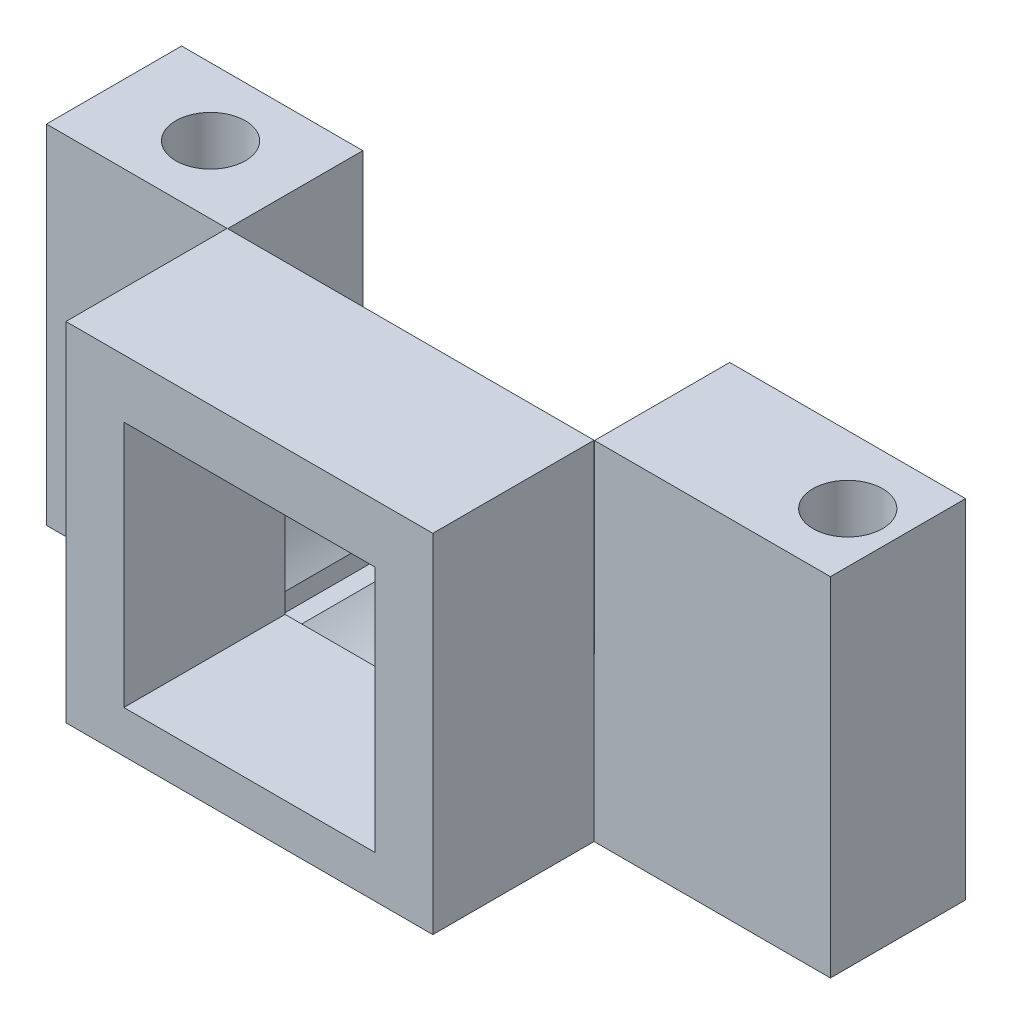
ISO-10303-21;
HEADER;
FILE_DESCRIPTION(('STEP AP214'),'2;1');
FILE_NAME('part.step','',(''),(''),'','','');
FILE_SCHEMA(('AUTOMOTIVE_DESIGN { 1 0 10303 214 1 1 1 1 }'));
ENDSEC;
DATA;
#1=APPLICATION_CONTEXT('core data for automotive mechanical design processes');
#2=APPLICATION_PROTOCOL_DEFINITION('international standard','automotive_design',2000,#1);
#3=PRODUCT_CONTEXT('',#1,'mechanical');
#4=PRODUCT('Part','Part','',(#3));
#5=PRODUCT_RELATED_PRODUCT_CATEGORY('part','',(#4));
#6=PRODUCT_DEFINITION_FORMATION('','',#4);
#7=PRODUCT_DEFINITION_CONTEXT('part definition',#1,'design');
#8=PRODUCT_DEFINITION('design','',#6,#7);
#9=PRODUCT_DEFINITION_SHAPE('','',#8);
#10=(LENGTH_UNIT() NAMED_UNIT(*) SI_UNIT(.MILLI.,.METRE.));
#11=(NAMED_UNIT(*) PLANE_ANGLE_UNIT() SI_UNIT($,.RADIAN.));
#12=(NAMED_UNIT(*) SI_UNIT($,.STERADIAN.) SOLID_ANGLE_UNIT());
#13=UNCERTAINTY_MEASURE_WITH_UNIT(LENGTH_MEASURE(1.E-05),#10,'distance_accuracy_value','');
#14=(GEOMETRIC_REPRESENTATION_CONTEXT(3) GLOBAL_UNCERTAINTY_ASSIGNED_CONTEXT((#13)) GLOBAL_UNIT_ASSIGNED_CONTEXT((#10,
#11,#12)) REPRESENTATION_CONTEXT('',''));
#15=CARTESIAN_POINT('',(0.,0.,0.));
#16=DIRECTION('',(0.,0.,1.));
#17=DIRECTION('',(1.,0.,0.));
#18=AXIS2_PLACEMENT_3D('',#15,#16,#17);
#19=CARTESIAN_POINT('',(18.3887402922752,10.3631468182852,7.));
#20=DIRECTION('',(0.,0.,-1.));
#21=DIRECTION('',(-1.,0.,0.));
#22=AXIS2_PLACEMENT_3D('',#19,#20,#21);
#23=CYLINDRICAL_SURFACE('',#22,8.75000000000001);
#24=CARTESIAN_POINT('',(18.3887402922752,10.3631468182852,0.));
#25=DIRECTION('',(0.,0.,1.));
#26=DIRECTION('',(1.,0.,0.));
#27=AXIS2_PLACEMENT_3D('',#24,#25,#26);
#28=CIRCLE('',#27,8.75000000000001);
#29=CARTESIAN_POINT('',(9.64212979628884,10.1196209849502,0.));
#30=VERTEX_POINT('',#29);
#31=CARTESIAN_POINT('',(11.6843212547284,4.7405793114446,0.));
#32=VERTEX_POINT('',#31);
#33=EDGE_CURVE('E292',#30,#32,#28,.T.);
#34=ORIENTED_EDGE('',*,*,#33,.F.);
#35=DIRECTION('',(0.,0.,-1.));
#36=VECTOR('',#35,1.);
#37=CARTESIAN_POINT('',(9.64212979628884,10.1196209849502,7.));
#38=LINE('',#37,#36);
#39=CARTESIAN_POINT('',(9.64212979628884,10.1196209849502,7.));
#40=VERTEX_POINT('',#39);
#41=EDGE_CURVE('E11',#40,#30,#38,.T.);
#42=ORIENTED_EDGE('',*,*,#41,.F.);
#43=CARTESIAN_POINT('',(18.3887402922752,10.3631468182852,7.));
#44=DIRECTION('',(0.,0.,1.));
#45=DIRECTION('',(1.,0.,0.));
#46=AXIS2_PLACEMENT_3D('',#43,#44,#45);
#47=CIRCLE('',#46,8.75000000000001);
#48=CARTESIAN_POINT('',(11.6843212547284,4.7405793114446,7.));
#49=VERTEX_POINT('',#48);
#50=EDGE_CURVE('E293',#40,#49,#47,.T.);
#51=ORIENTED_EDGE('',*,*,#50,.T.);
#52=DIRECTION('',(0.,0.,-1.));
#53=VECTOR('',#52,1.);
#54=CARTESIAN_POINT('',(11.6843212547284,4.7405793114446,7.));
#55=LINE('',#54,#53);
#56=EDGE_CURVE('E324',#49,#32,#55,.T.);
#57=ORIENTED_EDGE('',*,*,#56,.T.);
#58=EDGE_LOOP('',(#34,#42,#51,#57));
#59=FACE_BOUND('',#58,.T.);
#60=ADVANCED_FACE('F47',(#59),#23,.F.);
#61=CARTESIAN_POINT('',(0.,10.1196209849502,7.));
#62=DIRECTION('',(0.,1.,0.));
#63=DIRECTION('',(0.,0.,1.));
#64=AXIS2_PLACEMENT_3D('',#61,#62,#63);
#65=PLANE('',#64);
#66=DIRECTION('',(1.,0.,0.));
#67=VECTOR('',#66,1.);
#68=CARTESIAN_POINT('',(0.,10.1196209849502,0.));
#69=LINE('',#68,#67);
#70=CARTESIAN_POINT('',(8.88432125472841,10.1196209849502,0.));
#71=VERTEX_POINT('',#70);
#72=EDGE_CURVE('E328',#71,#30,#69,.T.);
#73=ORIENTED_EDGE('',*,*,#72,.F.);
#74=DIRECTION('',(0.,0.,-1.));
#75=VECTOR('',#74,1.);
#76=CARTESIAN_POINT('',(8.88432125472841,10.1196209849502,7.));
#77=LINE('',#76,#75);
#78=CARTESIAN_POINT('',(8.88432125472841,10.1196209849502,7.));
#79=VERTEX_POINT('',#78);
#80=EDGE_CURVE('E56',#79,#71,#77,.T.);
#81=ORIENTED_EDGE('',*,*,#80,.F.);
#82=DIRECTION('',(1.,0.,0.));
#83=VECTOR('',#82,1.);
#84=CARTESIAN_POINT('',(0.,10.1196209849502,7.));
#85=LINE('',#84,#83);
#86=EDGE_CURVE('E297',#79,#40,#85,.T.);
#87=ORIENTED_EDGE('',*,*,#86,.T.);
#88=ORIENTED_EDGE('',*,*,#41,.T.);
#89=EDGE_LOOP('',(#73,#81,#87,#88));
#90=FACE_BOUND('',#89,.T.);
#91=ADVANCED_FACE('F49',(#90),#65,.T.);
#92=CARTESIAN_POINT('',(8.88432125472841,0.,7.));
#93=DIRECTION('',(1.,0.,0.));
#94=DIRECTION('',(0.,0.,-1.));
#95=AXIS2_PLACEMENT_3D('',#92,#93,#94);
#96=PLANE('',#95);
#97=DIRECTION('',(0.,-1.,0.));
#98=VECTOR('',#97,1.);
#99=CARTESIAN_POINT('',(8.88432125472841,0.,0.));
#100=LINE('',#99,#98);
#101=CARTESIAN_POINT('',(8.88432125472841,19.7,0.));
#102=VERTEX_POINT('',#101);
#103=EDGE_CURVE('E333',#102,#71,#100,.T.);
#104=ORIENTED_EDGE('',*,*,#103,.F.);
#105=DIRECTION('',(0.,0.,-1.));
#106=VECTOR('',#105,1.);
#107=CARTESIAN_POINT('',(8.88432125472841,19.7,7.));
#108=LINE('',#107,#106);
#109=CARTESIAN_POINT('',(8.88432125472841,19.7,7.));
#110=VERTEX_POINT('',#109);
#111=EDGE_CURVE('E371',#110,#102,#108,.T.);
#112=ORIENTED_EDGE('',*,*,#111,.F.);
#113=DIRECTION('',(0.,-1.,0.));
#114=VECTOR('',#113,1.);
#115=CARTESIAN_POINT('',(8.88432125472841,0.,7.));
#116=LINE('',#115,#114);
#117=EDGE_CURVE('E303',#110,#79,#116,.T.);
#118=ORIENTED_EDGE('',*,*,#117,.T.);
#119=ORIENTED_EDGE('',*,*,#80,.T.);
#120=EDGE_LOOP('',(#104,#112,#118,#119));
#121=FACE_BOUND('',#120,.T.);
#122=ADVANCED_FACE('F377',(#121),#96,.T.);
#123=CARTESIAN_POINT('',(0.,19.7,7.));
#124=DIRECTION('',(0.,1.,0.));
#125=DIRECTION('',(0.,0.,1.));
#126=AXIS2_PLACEMENT_3D('',#123,#124,#125);
#127=PLANE('',#126);
#128=CARTESIAN_POINT('',(4.5,19.7,3.5));
#129=DIRECTION('',(0.,1.,0.));
#130=DIRECTION('',(0.,0.,1.));
#131=AXIS2_PLACEMENT_3D('',#128,#129,#130);
#132=CIRCLE('',#131,1.8);
#133=CARTESIAN_POINT('',(4.5,19.7,5.3));
#134=VERTEX_POINT('',#133);
#135=EDGE_CURVE('E544',#134,#134,#132,.T.);
#136=ORIENTED_EDGE('',*,*,#135,.F.);
#137=EDGE_LOOP('',(#136));
#138=FACE_BOUND('',#137,.T.);
#139=DIRECTION('',(1.,0.,0.));
#140=VECTOR('',#139,1.);
#141=CARTESIAN_POINT('',(0.,19.7,0.));
#142=LINE('',#141,#140);
#143=CARTESIAN_POINT('',(-0.5,19.7,0.));
#144=VERTEX_POINT('',#143);
#145=EDGE_CURVE('E337',#144,#102,#142,.T.);
#146=ORIENTED_EDGE('',*,*,#145,.F.);
#147=DIRECTION('',(0.,0.,-1.));
#148=VECTOR('',#147,1.);
#149=CARTESIAN_POINT('',(-0.5,19.7,7.));
#150=LINE('',#149,#148);
#151=CARTESIAN_POINT('',(-0.5,19.7,7.));
#152=VERTEX_POINT('',#151);
#153=EDGE_CURVE('E368',#152,#144,#150,.T.);
#154=ORIENTED_EDGE('',*,*,#153,.F.);
#155=DIRECTION('',(1.,0.,0.));
#156=VECTOR('',#155,1.);
#157=CARTESIAN_POINT('',(0.,19.7,7.));
#158=LINE('',#157,#156);
#159=CARTESIAN_POINT('',(8.86,19.7,7.));
#160=VERTEX_POINT('',#159);
#161=EDGE_CURVE('E307',#152,#160,#158,.T.);
#162=ORIENTED_EDGE('',*,*,#161,.T.);
#163=DIRECTION('',(0.,0.,-1.));
#164=VECTOR('',#163,1.);
#165=CARTESIAN_POINT('',(8.86,19.7,15.35));
#166=LINE('',#165,#164);
#167=CARTESIAN_POINT('',(8.86,19.7,15.35));
#168=VERTEX_POINT('',#167);
#169=EDGE_CURVE('E275',#168,#160,#166,.T.);
#170=ORIENTED_EDGE('',*,*,#169,.F.);
#171=DIRECTION('',(-1.,0.,0.));
#172=VECTOR('',#171,1.);
#173=CARTESIAN_POINT('',(8.86,19.7,15.35));
#174=LINE('',#173,#172);
#175=CARTESIAN_POINT('',(27.8603974424949,19.7,15.35));
#176=VERTEX_POINT('',#175);
#177=EDGE_CURVE('E280',#176,#168,#174,.T.);
#178=ORIENTED_EDGE('',*,*,#177,.F.);
#179=DIRECTION('',(0.,0.,-1.));
#180=VECTOR('',#179,1.);
#181=CARTESIAN_POINT('',(27.8603974424949,19.7,15.35));
#182=LINE('',#181,#180);
#183=CARTESIAN_POINT('',(27.8603974424949,19.7,7.));
#184=VERTEX_POINT('',#183);
#185=EDGE_CURVE('E279',#176,#184,#182,.T.);
#186=ORIENTED_EDGE('',*,*,#185,.T.);
#187=DIRECTION('',(-1.,0.,0.));
#188=VECTOR('',#187,1.);
#189=CARTESIAN_POINT('',(8.86,19.7,7.));
#190=LINE('',#189,#188);
#191=EDGE_CURVE('E270',#184,#110,#190,.T.);
#192=ORIENTED_EDGE('',*,*,#191,.T.);
#193=ORIENTED_EDGE('',*,*,#111,.T.);
#194=EDGE_LOOP('',(#146,#154,#162,#170,#178,#186,#192,#193));
#195=FACE_BOUND('',#194,.T.);
#196=ADVANCED_FACE('F388',(#138,#195),#127,.T.);
#197=CARTESIAN_POINT('',(-0.5,0.,7.));
#198=DIRECTION('',(1.,0.,0.));
#199=DIRECTION('',(0.,0.,-1.));
#200=AXIS2_PLACEMENT_3D('',#197,#198,#199);
#201=PLANE('',#200);
#202=DIRECTION('',(0.,-1.,0.));
#203=VECTOR('',#202,1.);
#204=CARTESIAN_POINT('',(-0.5,0.,0.));
#205=LINE('',#204,#203);
#206=CARTESIAN_POINT('',(-0.5,1.7,0.));
#207=VERTEX_POINT('',#206);
#208=EDGE_CURVE('E341',#144,#207,#205,.T.);
#209=ORIENTED_EDGE('',*,*,#208,.T.);
#210=DIRECTION('',(0.,0.,-1.));
#211=VECTOR('',#210,1.);
#212=CARTESIAN_POINT('',(-0.5,1.7,7.));
#213=LINE('',#212,#211);
#214=CARTESIAN_POINT('',(-0.5,1.7,7.));
#215=VERTEX_POINT('',#214);
#216=EDGE_CURVE('E364',#215,#207,#213,.T.);
#217=ORIENTED_EDGE('',*,*,#216,.F.);
#218=DIRECTION('',(0.,-1.,0.));
#219=VECTOR('',#218,1.);
#220=CARTESIAN_POINT('',(-0.5,0.,7.));
#221=LINE('',#220,#219);
#222=EDGE_CURVE('E310',#152,#215,#221,.T.);
#223=ORIENTED_EDGE('',*,*,#222,.F.);
#224=ORIENTED_EDGE('',*,*,#153,.T.);
#225=EDGE_LOOP('',(#209,#217,#223,#224));
#226=FACE_BOUND('',#225,.T.);
#227=ADVANCED_FACE('F562',(#226),#201,.F.);
#228=CARTESIAN_POINT('',(0.,1.7,7.));
#229=DIRECTION('',(0.,1.,0.));
#230=DIRECTION('',(-1.,0.,0.));
#231=AXIS2_PLACEMENT_3D('',#228,#229,#230);
#232=PLANE('',#231);
#233=CARTESIAN_POINT('',(4.5,1.7,3.5));
#234=DIRECTION('',(0.,1.,0.));
#235=DIRECTION('',(0.,0.,1.));
#236=AXIS2_PLACEMENT_3D('',#233,#234,#235);
#237=CIRCLE('',#236,1.8);
#238=CARTESIAN_POINT('',(4.5,1.7,5.3));
#239=VERTEX_POINT('',#238);
#240=EDGE_CURVE('E513',#239,#239,#237,.T.);
#241=ORIENTED_EDGE('',*,*,#240,.T.);
#242=EDGE_LOOP('',(#241));
#243=FACE_BOUND('',#242,.T.);
#244=CARTESIAN_POINT('',(37.5,1.7,3.5));
#245=DIRECTION('',(0.,1.,0.));
#246=DIRECTION('',(0.,0.,1.));
#247=AXIS2_PLACEMENT_3D('',#244,#245,#246);
#248=CIRCLE('',#247,1.8);
#249=CARTESIAN_POINT('',(37.5,1.7,5.3));
#250=VERTEX_POINT('',#249);
#251=EDGE_CURVE('E536',#250,#250,#248,.T.);
#252=ORIENTED_EDGE('',*,*,#251,.T.);
#253=EDGE_LOOP('',(#252));
#254=FACE_BOUND('',#253,.T.);
#255=DIRECTION('',(1.,0.,0.));
#256=VECTOR('',#255,1.);
#257=CARTESIAN_POINT('',(0.,1.7,0.));
#258=LINE('',#257,#256);
#259=CARTESIAN_POINT('',(17.1589487632613,1.7,0.));
#260=VERTEX_POINT('',#259);
#261=EDGE_CURVE('E344',#207,#260,#258,.T.);
#262=ORIENTED_EDGE('',*,*,#261,.T.);
#263=DIRECTION('',(0.,0.,-1.));
#264=VECTOR('',#263,1.);
#265=CARTESIAN_POINT('',(17.1589487632613,1.7,7.));
#266=LINE('',#265,#264);
#267=CARTESIAN_POINT('',(17.1589487632613,1.7,7.));
#268=VERTEX_POINT('',#267);
#269=EDGE_CURVE('E255',#268,#260,#266,.T.);
#270=ORIENTED_EDGE('',*,*,#269,.F.);
#271=DIRECTION('',(1.,0.,0.));
#272=VECTOR('',#271,1.);
#273=CARTESIAN_POINT('',(8.86,1.70000000000001,7.));
#274=LINE('',#273,#272);
#275=CARTESIAN_POINT('',(19.6185318212891,1.7,7.));
#276=VERTEX_POINT('',#275);
#277=EDGE_CURVE('E244',#268,#276,#274,.T.);
#278=ORIENTED_EDGE('',*,*,#277,.T.);
#279=DIRECTION('',(0.,0.,-1.));
#280=VECTOR('',#279,1.);
#281=CARTESIAN_POINT('',(19.6185318212891,1.7,7.));
#282=LINE('',#281,#280);
#283=CARTESIAN_POINT('',(19.6185318212891,1.7,0.));
#284=VERTEX_POINT('',#283);
#285=EDGE_CURVE('E224',#276,#284,#282,.T.);
#286=ORIENTED_EDGE('',*,*,#285,.T.);
#287=DIRECTION('',(1.,0.,0.));
#288=VECTOR('',#287,1.);
#289=CARTESIAN_POINT('',(0.,1.7,0.));
#290=LINE('',#289,#288);
#291=CARTESIAN_POINT('',(40.1,1.7,0.));
#292=VERTEX_POINT('',#291);
#293=EDGE_CURVE('E508',#284,#292,#290,.T.);
#294=ORIENTED_EDGE('',*,*,#293,.T.);
#295=DIRECTION('',(0.,0.,-1.));
#296=VECTOR('',#295,1.);
#297=CARTESIAN_POINT('',(40.1,1.7,7.));
#298=LINE('',#297,#296);
#299=CARTESIAN_POINT('',(40.1,1.7,7.));
#300=VERTEX_POINT('',#299);
#301=EDGE_CURVE('E237',#300,#292,#298,.T.);
#302=ORIENTED_EDGE('',*,*,#301,.F.);
#303=DIRECTION('',(1.,0.,0.));
#304=VECTOR('',#303,1.);
#305=CARTESIAN_POINT('',(0.,1.7,7.));
#306=LINE('',#305,#304);
#307=CARTESIAN_POINT('',(27.8603974424949,1.7,7.));
#308=VERTEX_POINT('',#307);
#309=EDGE_CURVE('E249',#308,#300,#306,.T.);
#310=ORIENTED_EDGE('',*,*,#309,.F.);
#311=DIRECTION('',(0.,0.,-1.));
#312=VECTOR('',#311,1.);
#313=CARTESIAN_POINT('',(27.8603974424949,1.70000000000001,15.35));
#314=LINE('',#313,#312);
#315=CARTESIAN_POINT('',(27.8603974424949,1.70000000000001,15.35));
#316=VERTEX_POINT('',#315);
#317=EDGE_CURVE('E284',#316,#308,#314,.T.);
#318=ORIENTED_EDGE('',*,*,#317,.F.);
#319=DIRECTION('',(1.,0.,0.));
#320=VECTOR('',#319,1.);
#321=CARTESIAN_POINT('',(8.86,1.70000000000001,15.35));
#322=LINE('',#321,#320);
#323=CARTESIAN_POINT('',(8.86,1.70000000000001,15.35));
#324=VERTEX_POINT('',#323);
#325=EDGE_CURVE('E410',#324,#316,#322,.T.);
#326=ORIENTED_EDGE('',*,*,#325,.F.);
#327=DIRECTION('',(0.,0.,-1.));
#328=VECTOR('',#327,1.);
#329=CARTESIAN_POINT('',(8.86,1.70000000000001,15.35));
#330=LINE('',#329,#328);
#331=CARTESIAN_POINT('',(8.86,1.70000000000001,7.));
#332=VERTEX_POINT('',#331);
#333=EDGE_CURVE('E288',#324,#332,#330,.T.);
#334=ORIENTED_EDGE('',*,*,#333,.T.);
#335=DIRECTION('',(1.,0.,0.));
#336=VECTOR('',#335,1.);
#337=CARTESIAN_POINT('',(0.,1.7,7.));
#338=LINE('',#337,#336);
#339=EDGE_CURVE('E313',#215,#332,#338,.T.);
#340=ORIENTED_EDGE('',*,*,#339,.F.);
#341=ORIENTED_EDGE('',*,*,#216,.T.);
#342=EDGE_LOOP('',(#262,#270,#278,#286,#294,#302,#310,#318,#326,#334,#340,#341));
#343=FACE_BOUND('',#342,.T.);
#344=ADVANCED_FACE('F254',(#243,#254,#343),#232,.F.);
#345=CARTESIAN_POINT('',(12.6181265718274,3.78572199626109,0.));
#346=VERTEX_POINT('',#345);
#347=EDGE_CURVE('E329',#346,#260,#28,.T.);
#348=ORIENTED_EDGE('',*,*,#347,.F.);
#349=DIRECTION('',(0.,0.,-1.));
#350=VECTOR('',#349,1.);
#351=CARTESIAN_POINT('',(12.6181265718274,3.78572199626109,7.));
#352=LINE('',#351,#350);
#353=CARTESIAN_POINT('',(12.6181265718274,3.78572199626109,7.));
#354=VERTEX_POINT('',#353);
#355=EDGE_CURVE('E359',#354,#346,#352,.T.);
#356=ORIENTED_EDGE('',*,*,#355,.F.);
#357=EDGE_CURVE('E299',#354,#268,#47,.T.);
#358=ORIENTED_EDGE('',*,*,#357,.T.);
#359=ORIENTED_EDGE('',*,*,#269,.T.);
#360=EDGE_LOOP('',(#348,#356,#358,#359));
#361=FACE_BOUND('',#360,.T.);
#362=ADVANCED_FACE('F574',(#361),#23,.F.);
#363=CARTESIAN_POINT('',(0.,3.78572199626109,7.));
#364=DIRECTION('',(0.,1.,0.));
#365=DIRECTION('',(0.,0.,1.));
#366=AXIS2_PLACEMENT_3D('',#363,#364,#365);
#367=PLANE('',#366);
#368=DIRECTION('',(1.,0.,0.));
#369=VECTOR('',#368,1.);
#370=CARTESIAN_POINT('',(0.,3.78572199626109,0.));
#371=LINE('',#370,#369);
#372=CARTESIAN_POINT('',(11.6843212547284,3.78572199626109,0.));
#373=VERTEX_POINT('',#372);
#374=EDGE_CURVE('E347',#373,#346,#371,.T.);
#375=ORIENTED_EDGE('',*,*,#374,.F.);
#376=DIRECTION('',(0.,0.,-1.));
#377=VECTOR('',#376,1.);
#378=CARTESIAN_POINT('',(11.6843212547284,3.78572199626109,7.));
#379=LINE('',#378,#377);
#380=CARTESIAN_POINT('',(11.6843212547284,3.78572199626109,7.));
#381=VERTEX_POINT('',#380);
#382=EDGE_CURVE('E356',#381,#373,#379,.T.);
#383=ORIENTED_EDGE('',*,*,#382,.F.);
#384=DIRECTION('',(1.,0.,0.));
#385=VECTOR('',#384,1.);
#386=CARTESIAN_POINT('',(0.,3.78572199626109,7.));
#387=LINE('',#386,#385);
#388=EDGE_CURVE('E316',#381,#354,#387,.T.);
#389=ORIENTED_EDGE('',*,*,#388,.T.);
#390=ORIENTED_EDGE('',*,*,#355,.T.);
#391=EDGE_LOOP('',(#375,#383,#389,#390));
#392=FACE_BOUND('',#391,.T.);
#393=ADVANCED_FACE('F401',(#392),#367,.T.);
#394=CARTESIAN_POINT('',(11.6843212547284,0.,7.));
#395=DIRECTION('',(1.,0.,0.));
#396=DIRECTION('',(0.,0.,-1.));
#397=AXIS2_PLACEMENT_3D('',#394,#395,#396);
#398=PLANE('',#397);
#399=DIRECTION('',(0.,-1.,0.));
#400=VECTOR('',#399,1.);
#401=CARTESIAN_POINT('',(11.6843212547284,0.,0.));
#402=LINE('',#401,#400);
#403=EDGE_CURVE('E298',#32,#373,#402,.T.);
#404=ORIENTED_EDGE('',*,*,#403,.F.);
#405=ORIENTED_EDGE('',*,*,#56,.F.);
#406=DIRECTION('',(0.,-1.,0.));
#407=VECTOR('',#406,1.);
#408=CARTESIAN_POINT('',(11.6843212547284,0.,7.));
#409=LINE('',#408,#407);
#410=EDGE_CURVE('E320',#49,#381,#409,.T.);
#411=ORIENTED_EDGE('',*,*,#410,.T.);
#412=ORIENTED_EDGE('',*,*,#382,.T.);
#413=EDGE_LOOP('',(#404,#405,#411,#412));
#414=FACE_BOUND('',#413,.T.);
#415=ADVANCED_FACE('F398',(#414),#398,.T.);
#416=CARTESIAN_POINT('',(0.,0.,7.));
#417=DIRECTION('',(0.,0.,1.));
#418=DIRECTION('',(1.,0.,0.));
#419=AXIS2_PLACEMENT_3D('',#416,#417,#418);
#420=PLANE('',#419);
#421=DIRECTION('',(0.,-1.,0.));
#422=VECTOR('',#421,1.);
#423=CARTESIAN_POINT('',(8.86,19.7,7.));
#424=LINE('',#423,#422);
#425=EDGE_CURVE('E71',#160,#332,#424,.T.);
#426=ORIENTED_EDGE('',*,*,#425,.F.);
#427=ORIENTED_EDGE('',*,*,#161,.F.);
#428=ORIENTED_EDGE('',*,*,#222,.T.);
#429=ORIENTED_EDGE('',*,*,#339,.T.);
#430=EDGE_LOOP('',(#426,#427,#428,#429));
#431=FACE_BOUND('',#430,.T.);
#432=ADVANCED_FACE('F772',(#431),#420,.T.);
#433=CARTESIAN_POINT('',(0.,0.,0.));
#434=DIRECTION('',(0.,0.,1.));
#435=DIRECTION('',(1.,0.,0.));
#436=AXIS2_PLACEMENT_3D('',#433,#434,#435);
#437=PLANE('',#436);
#438=ORIENTED_EDGE('',*,*,#33,.T.);
#439=ORIENTED_EDGE('',*,*,#403,.T.);
#440=ORIENTED_EDGE('',*,*,#374,.T.);
#441=ORIENTED_EDGE('',*,*,#347,.T.);
#442=ORIENTED_EDGE('',*,*,#261,.F.);
#443=ORIENTED_EDGE('',*,*,#208,.F.);
#444=ORIENTED_EDGE('',*,*,#145,.T.);
#445=ORIENTED_EDGE('',*,*,#103,.T.);
#446=ORIENTED_EDGE('',*,*,#72,.T.);
#447=EDGE_LOOP('',(#438,#439,#440,#441,#442,#443,#444,#445,#446));
#448=FACE_BOUND('',#447,.T.);
#449=ADVANCED_FACE('F383',(#448),#437,.F.);
#450=CARTESIAN_POINT('',(0.,0.,15.35));
#451=DIRECTION('',(0.,0.,1.));
#452=DIRECTION('',(1.,0.,0.));
#453=AXIS2_PLACEMENT_3D('',#450,#451,#452);
#454=PLANE('',#453);
#455=DIRECTION('',(0.,-1.,0.));
#456=VECTOR('',#455,1.);
#457=CARTESIAN_POINT('',(8.86,19.7,15.35));
#458=LINE('',#457,#456);
#459=EDGE_CURVE('E274',#168,#324,#458,.T.);
#460=ORIENTED_EDGE('',*,*,#459,.T.);
#461=ORIENTED_EDGE('',*,*,#325,.T.);
#462=DIRECTION('',(0.,1.,0.));
#463=VECTOR('',#462,1.);
#464=CARTESIAN_POINT('',(27.8603974424949,19.7,15.35));
#465=LINE('',#464,#463);
#466=EDGE_CURVE('E408',#316,#176,#465,.T.);
#467=ORIENTED_EDGE('',*,*,#466,.T.);
#468=ORIENTED_EDGE('',*,*,#177,.T.);
#469=EDGE_LOOP('',(#460,#461,#467,#468));
#470=FACE_BOUND('',#469,.T.);
#471=DIRECTION('',(1.,0.,0.));
#472=VECTOR('',#471,1.);
#473=CARTESIAN_POINT('',(11.8603974424954,3.88746318309419,15.35));
#474=LINE('',#473,#472);
#475=CARTESIAN_POINT('',(11.8603974424954,3.88746318309419,15.35));
#476=VERTEX_POINT('',#475);
#477=CARTESIAN_POINT('',(24.8603974424949,3.88746318309419,15.35));
#478=VERTEX_POINT('',#477);
#479=EDGE_CURVE('E456',#476,#478,#474,.T.);
#480=ORIENTED_EDGE('',*,*,#479,.F.);
#481=DIRECTION('',(0.,-1.,0.));
#482=VECTOR('',#481,1.);
#483=CARTESIAN_POINT('',(11.8603974424954,16.6874631830942,15.35));
#484=LINE('',#483,#482);
#485=CARTESIAN_POINT('',(11.8603974424954,16.6874631830942,15.35));
#486=VERTEX_POINT('',#485);
#487=EDGE_CURVE('E438',#486,#476,#484,.T.);
#488=ORIENTED_EDGE('',*,*,#487,.F.);
#489=DIRECTION('',(-1.,0.,0.));
#490=VECTOR('',#489,1.);
#491=CARTESIAN_POINT('',(11.8603974424954,16.6874631830942,15.35));
#492=LINE('',#491,#490);
#493=CARTESIAN_POINT('',(24.8603974424949,16.6874631830942,15.35));
#494=VERTEX_POINT('',#493);
#495=EDGE_CURVE('E433',#494,#486,#492,.T.);
#496=ORIENTED_EDGE('',*,*,#495,.F.);
#497=DIRECTION('',(0.,1.,0.));
#498=VECTOR('',#497,1.);
#499=CARTESIAN_POINT('',(24.8603974424949,16.6874631830942,15.35));
#500=LINE('',#499,#498);
#501=EDGE_CURVE('E452',#478,#494,#500,.T.);
#502=ORIENTED_EDGE('',*,*,#501,.F.);
#503=EDGE_LOOP('',(#480,#488,#496,#502));
#504=FACE_BOUND('',#503,.T.);
#505=ADVANCED_FACE('F679',(#470,#504),#454,.T.);
#506=CARTESIAN_POINT('',(0.,0.,7.));
#507=DIRECTION('',(0.,0.,1.));
#508=DIRECTION('',(1.,0.,0.));
#509=AXIS2_PLACEMENT_3D('',#506,#507,#508);
#510=PLANE('',#509);
#511=DIRECTION('',(1.,0.,0.));
#512=VECTOR('',#511,1.);
#513=CARTESIAN_POINT('',(0.,3.78572199626109,7.));
#514=LINE('',#513,#512);
#515=CARTESIAN_POINT('',(24.159354012723,3.78572199626109,7.));
#516=VERTEX_POINT('',#515);
#517=CARTESIAN_POINT('',(25.0843212547284,3.78572199626109,7.));
#518=VERTEX_POINT('',#517);
#519=EDGE_CURVE('E247',#516,#518,#514,.T.);
#520=ORIENTED_EDGE('',*,*,#519,.F.);
#521=CARTESIAN_POINT('',(18.3887402922752,10.3631468182852,7.));
#522=DIRECTION('',(0.,0.,1.));
#523=DIRECTION('',(1.,0.,0.));
#524=AXIS2_PLACEMENT_3D('',#521,#522,#523);
#525=CIRCLE('',#524,8.75000000000001);
#526=EDGE_CURVE('E227',#276,#516,#525,.T.);
#527=ORIENTED_EDGE('',*,*,#526,.F.);
#528=ORIENTED_EDGE('',*,*,#277,.F.);
#529=ORIENTED_EDGE('',*,*,#357,.F.);
#530=ORIENTED_EDGE('',*,*,#388,.F.);
#531=ORIENTED_EDGE('',*,*,#410,.F.);
#532=ORIENTED_EDGE('',*,*,#50,.F.);
#533=ORIENTED_EDGE('',*,*,#86,.F.);
#534=ORIENTED_EDGE('',*,*,#117,.F.);
#535=ORIENTED_EDGE('',*,*,#191,.F.);
#536=DIRECTION('',(0.,1.,0.));
#537=VECTOR('',#536,1.);
#538=CARTESIAN_POINT('',(27.8603974424949,19.7,7.));
#539=LINE('',#538,#537);
#540=CARTESIAN_POINT('',(27.8603974424949,10.1196209849502,7.));
#541=VERTEX_POINT('',#540);
#542=EDGE_CURVE('E258',#541,#184,#539,.T.);
#543=ORIENTED_EDGE('',*,*,#542,.F.);
#544=DIRECTION('',(1.,0.,0.));
#545=VECTOR('',#544,1.);
#546=CARTESIAN_POINT('',(0.,10.1196209849502,7.));
#547=LINE('',#546,#545);
#548=CARTESIAN_POINT('',(27.1353507882615,10.1196209849502,7.));
#549=VERTEX_POINT('',#548);
#550=EDGE_CURVE('E63',#549,#541,#547,.T.);
#551=ORIENTED_EDGE('',*,*,#550,.F.);
#552=CARTESIAN_POINT('',(25.0843212547284,4.73005747270991,7.));
#553=VERTEX_POINT('',#552);
#554=EDGE_CURVE('E252',#553,#549,#525,.T.);
#555=ORIENTED_EDGE('',*,*,#554,.F.);
#556=DIRECTION('',(0.,-1.,0.));
#557=VECTOR('',#556,1.);
#558=CARTESIAN_POINT('',(25.0843212547284,0.,7.));
#559=LINE('',#558,#557);
#560=EDGE_CURVE('E516',#553,#518,#559,.T.);
#561=ORIENTED_EDGE('',*,*,#560,.T.);
#562=EDGE_LOOP('',(#520,#527,#528,#529,#530,#531,#532,#533,#534,#535,#543,#551,#555,#561));
#563=FACE_BOUND('',#562,.T.);
#564=DIRECTION('',(0.,-1.,0.));
#565=VECTOR('',#564,1.);
#566=CARTESIAN_POINT('',(11.8603974424954,16.6874631830942,7.));
#567=LINE('',#566,#565);
#568=CARTESIAN_POINT('',(11.8603974424954,16.6874631830942,7.));
#569=VERTEX_POINT('',#568);
#570=CARTESIAN_POINT('',(11.8603974424954,3.88746318309419,7.));
#571=VERTEX_POINT('',#570);
#572=EDGE_CURVE('E236',#569,#571,#567,.T.);
#573=ORIENTED_EDGE('',*,*,#572,.T.);
#574=DIRECTION('',(1.,0.,0.));
#575=VECTOR('',#574,1.);
#576=CARTESIAN_POINT('',(11.8603974424954,3.88746318309419,7.));
#577=LINE('',#576,#575);
#578=CARTESIAN_POINT('',(24.8603974424949,3.88746318309419,7.));
#579=VERTEX_POINT('',#578);
#580=EDGE_CURVE('E443',#571,#579,#577,.T.);
#581=ORIENTED_EDGE('',*,*,#580,.T.);
#582=DIRECTION('',(0.,1.,0.));
#583=VECTOR('',#582,1.);
#584=CARTESIAN_POINT('',(24.8603974424949,16.6874631830942,7.));
#585=LINE('',#584,#583);
#586=CARTESIAN_POINT('',(24.8603974424949,16.6874631830942,7.));
#587=VERTEX_POINT('',#586);
#588=EDGE_CURVE('E439',#579,#587,#585,.T.);
#589=ORIENTED_EDGE('',*,*,#588,.T.);
#590=DIRECTION('',(-1.,0.,0.));
#591=VECTOR('',#590,1.);
#592=CARTESIAN_POINT('',(11.8603974424954,16.6874631830942,7.));
#593=LINE('',#592,#591);
#594=EDGE_CURVE('E434',#587,#569,#593,.T.);
#595=ORIENTED_EDGE('',*,*,#594,.T.);
#596=EDGE_LOOP('',(#573,#581,#589,#595));
#597=FACE_BOUND('',#596,.T.);
#598=ADVANCED_FACE('F241',(#563,#597),#510,.F.);
#599=CARTESIAN_POINT('',(8.86,19.7,15.35));
#600=DIRECTION('',(1.,0.,0.));
#601=DIRECTION('',(0.,1.,0.));
#602=AXIS2_PLACEMENT_3D('',#599,#600,#601);
#603=PLANE('',#602);
#604=ORIENTED_EDGE('',*,*,#425,.T.);
#605=ORIENTED_EDGE('',*,*,#333,.F.);
#606=ORIENTED_EDGE('',*,*,#459,.F.);
#607=ORIENTED_EDGE('',*,*,#169,.T.);
#608=EDGE_LOOP('',(#604,#605,#606,#607));
#609=FACE_BOUND('',#608,.T.);
#610=ADVANCED_FACE('F662',(#609),#603,.F.);
#611=CARTESIAN_POINT('',(27.8603974424949,19.7,15.35));
#612=DIRECTION('',(-1.,0.,0.));
#613=DIRECTION('',(0.,0.,1.));
#614=AXIS2_PLACEMENT_3D('',#611,#612,#613);
#615=PLANE('',#614);
#616=EDGE_CURVE('E262',#308,#541,#539,.T.);
#617=ORIENTED_EDGE('',*,*,#616,.T.);
#618=ORIENTED_EDGE('',*,*,#542,.T.);
#619=ORIENTED_EDGE('',*,*,#185,.F.);
#620=ORIENTED_EDGE('',*,*,#466,.F.);
#621=ORIENTED_EDGE('',*,*,#317,.T.);
#622=EDGE_LOOP('',(#617,#618,#619,#620,#621));
#623=FACE_BOUND('',#622,.T.);
#624=ADVANCED_FACE('F653',(#623),#615,.F.);
#625=CARTESIAN_POINT('',(11.8603974424954,16.6874631830942,15.35));
#626=DIRECTION('',(1.,0.,0.));
#627=DIRECTION('',(0.,1.,0.));
#628=AXIS2_PLACEMENT_3D('',#625,#626,#627);
#629=PLANE('',#628);
#630=ORIENTED_EDGE('',*,*,#572,.F.);
#631=DIRECTION('',(0.,0.,-1.));
#632=VECTOR('',#631,1.);
#633=CARTESIAN_POINT('',(11.8603974424954,16.6874631830942,15.35));
#634=LINE('',#633,#632);
#635=EDGE_CURVE('E429',#486,#569,#634,.T.);
#636=ORIENTED_EDGE('',*,*,#635,.F.);
#637=ORIENTED_EDGE('',*,*,#487,.T.);
#638=DIRECTION('',(0.,0.,-1.));
#639=VECTOR('',#638,1.);
#640=CARTESIAN_POINT('',(11.8603974424954,3.88746318309419,15.35));
#641=LINE('',#640,#639);
#642=EDGE_CURVE('E264',#476,#571,#641,.T.);
#643=ORIENTED_EDGE('',*,*,#642,.T.);
#644=EDGE_LOOP('',(#630,#636,#637,#643));
#645=FACE_BOUND('',#644,.T.);
#646=ADVANCED_FACE('F644',(#645),#629,.T.);
#647=CARTESIAN_POINT('',(11.8603974424954,3.88746318309419,15.35));
#648=DIRECTION('',(0.,1.,0.));
#649=DIRECTION('',(0.,0.,1.));
#650=AXIS2_PLACEMENT_3D('',#647,#648,#649);
#651=PLANE('',#650);
#652=ORIENTED_EDGE('',*,*,#580,.F.);
#653=ORIENTED_EDGE('',*,*,#642,.F.);
#654=ORIENTED_EDGE('',*,*,#479,.T.);
#655=DIRECTION('',(0.,0.,-1.));
#656=VECTOR('',#655,1.);
#657=CARTESIAN_POINT('',(24.8603974424949,3.88746318309419,15.35));
#658=LINE('',#657,#656);
#659=EDGE_CURVE('E423',#478,#579,#658,.T.);
#660=ORIENTED_EDGE('',*,*,#659,.T.);
#661=EDGE_LOOP('',(#652,#653,#654,#660));
#662=FACE_BOUND('',#661,.T.);
#663=ADVANCED_FACE('F635',(#662),#651,.T.);
#664=CARTESIAN_POINT('',(24.8603974424949,16.6874631830942,15.35));
#665=DIRECTION('',(-1.,0.,0.));
#666=DIRECTION('',(0.,0.,1.));
#667=AXIS2_PLACEMENT_3D('',#664,#665,#666);
#668=PLANE('',#667);
#669=ORIENTED_EDGE('',*,*,#588,.F.);
#670=ORIENTED_EDGE('',*,*,#659,.F.);
#671=ORIENTED_EDGE('',*,*,#501,.T.);
#672=DIRECTION('',(0.,0.,-1.));
#673=VECTOR('',#672,1.);
#674=CARTESIAN_POINT('',(24.8603974424949,16.6874631830942,15.35));
#675=LINE('',#674,#673);
#676=EDGE_CURVE('E426',#494,#587,#675,.T.);
#677=ORIENTED_EDGE('',*,*,#676,.T.);
#678=EDGE_LOOP('',(#669,#670,#671,#677));
#679=FACE_BOUND('',#678,.T.);
#680=ADVANCED_FACE('F626',(#679),#668,.T.);
#681=CARTESIAN_POINT('',(11.8603974424954,16.6874631830942,15.35));
#682=DIRECTION('',(0.,-1.,0.));
#683=DIRECTION('',(0.,0.,-1.));
#684=AXIS2_PLACEMENT_3D('',#681,#682,#683);
#685=PLANE('',#684);
#686=ORIENTED_EDGE('',*,*,#594,.F.);
#687=ORIENTED_EDGE('',*,*,#676,.F.);
#688=ORIENTED_EDGE('',*,*,#495,.T.);
#689=ORIENTED_EDGE('',*,*,#635,.T.);
#690=EDGE_LOOP('',(#686,#687,#688,#689));
#691=FACE_BOUND('',#690,.T.);
#692=ADVANCED_FACE('F621',(#691),#685,.T.);
#693=CARTESIAN_POINT('',(0.,0.,7.));
#694=DIRECTION('',(0.,0.,1.));
#695=DIRECTION('',(1.,0.,0.));
#696=AXIS2_PLACEMENT_3D('',#693,#694,#695);
#697=PLANE('',#696);
#698=ORIENTED_EDGE('',*,*,#616,.F.);
#699=ORIENTED_EDGE('',*,*,#309,.T.);
#700=DIRECTION('',(0.,-1.,0.));
#701=VECTOR('',#700,1.);
#702=CARTESIAN_POINT('',(40.1,0.,7.));
#703=LINE('',#702,#701);
#704=CARTESIAN_POINT('',(40.1,19.7,7.));
#705=VERTEX_POINT('',#704);
#706=EDGE_CURVE('E530',#705,#300,#703,.T.);
#707=ORIENTED_EDGE('',*,*,#706,.F.);
#708=DIRECTION('',(1.,0.,0.));
#709=VECTOR('',#708,1.);
#710=CARTESIAN_POINT('',(0.,19.7,7.));
#711=LINE('',#710,#709);
#712=CARTESIAN_POINT('',(27.8843212547284,19.7,7.));
#713=VERTEX_POINT('',#712);
#714=EDGE_CURVE('E526',#713,#705,#711,.T.);
#715=ORIENTED_EDGE('',*,*,#714,.F.);
#716=DIRECTION('',(0.,-1.,0.));
#717=VECTOR('',#716,1.);
#718=CARTESIAN_POINT('',(27.8843212547284,0.,7.));
#719=LINE('',#718,#717);
#720=CARTESIAN_POINT('',(27.8843212547284,10.1196209849502,7.));
#721=VERTEX_POINT('',#720);
#722=EDGE_CURVE('E522',#713,#721,#719,.T.);
#723=ORIENTED_EDGE('',*,*,#722,.T.);
#724=EDGE_CURVE('E521',#541,#721,#547,.T.);
#725=ORIENTED_EDGE('',*,*,#724,.F.);
#726=EDGE_LOOP('',(#698,#699,#707,#715,#723,#725));
#727=FACE_BOUND('',#726,.T.);
#728=ADVANCED_FACE('F625',(#727),#697,.T.);
#729=CARTESIAN_POINT('',(18.3887402922752,10.3631468182852,7.));
#730=DIRECTION('',(0.,0.,-1.));
#731=DIRECTION('',(-1.,0.,0.));
#732=AXIS2_PLACEMENT_3D('',#729,#730,#731);
#733=CYLINDRICAL_SURFACE('',#732,8.75000000000001);
#734=CARTESIAN_POINT('',(18.3887402922752,10.3631468182852,0.));
#735=DIRECTION('',(0.,0.,1.));
#736=DIRECTION('',(1.,0.,0.));
#737=AXIS2_PLACEMENT_3D('',#734,#735,#736);
#738=CIRCLE('',#737,8.75000000000001);
#739=CARTESIAN_POINT('',(24.159354012723,3.78572199626109,0.));
#740=VERTEX_POINT('',#739);
#741=EDGE_CURVE('E230',#284,#740,#738,.T.);
#742=ORIENTED_EDGE('',*,*,#741,.F.);
#743=ORIENTED_EDGE('',*,*,#285,.F.);
#744=ORIENTED_EDGE('',*,*,#526,.T.);
#745=DIRECTION('',(0.,0.,-1.));
#746=VECTOR('',#745,1.);
#747=CARTESIAN_POINT('',(24.159354012723,3.78572199626109,7.));
#748=LINE('',#747,#746);
#749=EDGE_CURVE('E481',#516,#740,#748,.T.);
#750=ORIENTED_EDGE('',*,*,#749,.T.);
#751=EDGE_LOOP('',(#742,#743,#744,#750));
#752=FACE_BOUND('',#751,.T.);
#753=ADVANCED_FACE('F226',(#752),#733,.F.);
#754=CARTESIAN_POINT('',(40.1,0.,7.));
#755=DIRECTION('',(1.,0.,0.));
#756=DIRECTION('',(0.,0.,-1.));
#757=AXIS2_PLACEMENT_3D('',#754,#755,#756);
#758=PLANE('',#757);
#759=DIRECTION('',(0.,-1.,0.));
#760=VECTOR('',#759,1.);
#761=CARTESIAN_POINT('',(40.1,0.,0.));
#762=LINE('',#761,#760);
#763=CARTESIAN_POINT('',(40.1,19.7,0.));
#764=VERTEX_POINT('',#763);
#765=EDGE_CURVE('E504',#764,#292,#762,.T.);
#766=ORIENTED_EDGE('',*,*,#765,.F.);
#767=DIRECTION('',(0.,0.,-1.));
#768=VECTOR('',#767,1.);
#769=CARTESIAN_POINT('',(40.1,19.7,7.));
#770=LINE('',#769,#768);
#771=EDGE_CURVE('E463',#705,#764,#770,.T.);
#772=ORIENTED_EDGE('',*,*,#771,.F.);
#773=ORIENTED_EDGE('',*,*,#706,.T.);
#774=ORIENTED_EDGE('',*,*,#301,.T.);
#775=EDGE_LOOP('',(#766,#772,#773,#774));
#776=FACE_BOUND('',#775,.T.);
#777=ADVANCED_FACE('F597',(#776),#758,.T.);
#778=CARTESIAN_POINT('',(0.,19.7,7.));
#779=DIRECTION('',(0.,1.,0.));
#780=DIRECTION('',(0.,0.,1.));
#781=AXIS2_PLACEMENT_3D('',#778,#779,#780);
#782=PLANE('',#781);
#783=CARTESIAN_POINT('',(37.5,19.7,3.5));
#784=DIRECTION('',(0.,1.,0.));
#785=DIRECTION('',(0.,0.,1.));
#786=AXIS2_PLACEMENT_3D('',#783,#784,#785);
#787=CIRCLE('',#786,1.8);
#788=CARTESIAN_POINT('',(37.5,19.7,5.3));
#789=VERTEX_POINT('',#788);
#790=EDGE_CURVE('E540',#789,#789,#787,.T.);
#791=ORIENTED_EDGE('',*,*,#790,.F.);
#792=EDGE_LOOP('',(#791));
#793=FACE_BOUND('',#792,.T.);
#794=DIRECTION('',(1.,0.,0.));
#795=VECTOR('',#794,1.);
#796=CARTESIAN_POINT('',(0.,19.7,0.));
#797=LINE('',#796,#795);
#798=CARTESIAN_POINT('',(27.8843212547284,19.7,0.));
#799=VERTEX_POINT('',#798);
#800=EDGE_CURVE('E500',#799,#764,#797,.T.);
#801=ORIENTED_EDGE('',*,*,#800,.F.);
#802=DIRECTION('',(0.,0.,-1.));
#803=VECTOR('',#802,1.);
#804=CARTESIAN_POINT('',(27.8843212547284,19.7,7.));
#805=LINE('',#804,#803);
#806=EDGE_CURVE('E466',#713,#799,#805,.T.);
#807=ORIENTED_EDGE('',*,*,#806,.F.);
#808=ORIENTED_EDGE('',*,*,#714,.T.);
#809=ORIENTED_EDGE('',*,*,#771,.T.);
#810=EDGE_LOOP('',(#801,#807,#808,#809));
#811=FACE_BOUND('',#810,.T.);
#812=ADVANCED_FACE('F592',(#793,#811),#782,.T.);
#813=CARTESIAN_POINT('',(27.8843212547284,0.,7.));
#814=DIRECTION('',(1.,0.,0.));
#815=DIRECTION('',(0.,0.,-1.));
#816=AXIS2_PLACEMENT_3D('',#813,#814,#815);
#817=PLANE('',#816);
#818=DIRECTION('',(0.,-1.,0.));
#819=VECTOR('',#818,1.);
#820=CARTESIAN_POINT('',(27.8843212547284,0.,0.));
#821=LINE('',#820,#819);
#822=CARTESIAN_POINT('',(27.8843212547284,10.1196209849502,0.));
#823=VERTEX_POINT('',#822);
#824=EDGE_CURVE('E496',#799,#823,#821,.T.);
#825=ORIENTED_EDGE('',*,*,#824,.T.);
#826=DIRECTION('',(0.,0.,-1.));
#827=VECTOR('',#826,1.);
#828=CARTESIAN_POINT('',(27.8843212547284,10.1196209849502,7.));
#829=LINE('',#828,#827);
#830=EDGE_CURVE('E469',#721,#823,#829,.T.);
#831=ORIENTED_EDGE('',*,*,#830,.F.);
#832=ORIENTED_EDGE('',*,*,#722,.F.);
#833=ORIENTED_EDGE('',*,*,#806,.T.);
#834=EDGE_LOOP('',(#825,#831,#832,#833));
#835=FACE_BOUND('',#834,.T.);
#836=ADVANCED_FACE('F596',(#835),#817,.F.);
#837=CARTESIAN_POINT('',(0.,10.1196209849502,7.));
#838=DIRECTION('',(0.,1.,0.));
#839=DIRECTION('',(0.,0.,1.));
#840=AXIS2_PLACEMENT_3D('',#837,#838,#839);
#841=PLANE('',#840);
#842=DIRECTION('',(1.,0.,0.));
#843=VECTOR('',#842,1.);
#844=CARTESIAN_POINT('',(0.,10.1196209849502,0.));
#845=LINE('',#844,#843);
#846=CARTESIAN_POINT('',(27.1353507882615,10.1196209849502,0.));
#847=VERTEX_POINT('',#846);
#848=EDGE_CURVE('E492',#847,#823,#845,.T.);
#849=ORIENTED_EDGE('',*,*,#848,.F.);
#850=DIRECTION('',(0.,0.,-1.));
#851=VECTOR('',#850,1.);
#852=CARTESIAN_POINT('',(27.1353507882615,10.1196209849502,7.));
#853=LINE('',#852,#851);
#854=EDGE_CURVE('E472',#549,#847,#853,.T.);
#855=ORIENTED_EDGE('',*,*,#854,.F.);
#856=ORIENTED_EDGE('',*,*,#550,.T.);
#857=ORIENTED_EDGE('',*,*,#724,.T.);
#858=ORIENTED_EDGE('',*,*,#830,.T.);
#859=EDGE_LOOP('',(#849,#855,#856,#857,#858));
#860=FACE_BOUND('',#859,.T.);
#861=ADVANCED_FACE('F722',(#860),#841,.T.);
#862=CARTESIAN_POINT('',(25.0843212547284,4.73005747270991,0.));
#863=VERTEX_POINT('',#862);
#864=EDGE_CURVE('E491',#863,#847,#738,.T.);
#865=ORIENTED_EDGE('',*,*,#864,.F.);
#866=DIRECTION('',(0.,0.,-1.));
#867=VECTOR('',#866,1.);
#868=CARTESIAN_POINT('',(25.0843212547284,4.73005747270991,7.));
#869=LINE('',#868,#867);
#870=EDGE_CURVE('E475',#553,#863,#869,.T.);
#871=ORIENTED_EDGE('',*,*,#870,.F.);
#872=ORIENTED_EDGE('',*,*,#554,.T.);
#873=ORIENTED_EDGE('',*,*,#854,.T.);
#874=EDGE_LOOP('',(#865,#871,#872,#873));
#875=FACE_BOUND('',#874,.T.);
#876=ADVANCED_FACE('F712',(#875),#733,.F.);
#877=CARTESIAN_POINT('',(25.0843212547284,0.,7.));
#878=DIRECTION('',(1.,0.,0.));
#879=DIRECTION('',(0.,0.,-1.));
#880=AXIS2_PLACEMENT_3D('',#877,#878,#879);
#881=PLANE('',#880);
#882=DIRECTION('',(0.,-1.,0.));
#883=VECTOR('',#882,1.);
#884=CARTESIAN_POINT('',(25.0843212547284,0.,0.));
#885=LINE('',#884,#883);
#886=CARTESIAN_POINT('',(25.0843212547284,3.78572199626109,0.));
#887=VERTEX_POINT('',#886);
#888=EDGE_CURVE('E487',#863,#887,#885,.T.);
#889=ORIENTED_EDGE('',*,*,#888,.T.);
#890=DIRECTION('',(0.,0.,-1.));
#891=VECTOR('',#890,1.);
#892=CARTESIAN_POINT('',(25.0843212547284,3.78572199626109,7.));
#893=LINE('',#892,#891);
#894=EDGE_CURVE('E478',#518,#887,#893,.T.);
#895=ORIENTED_EDGE('',*,*,#894,.F.);
#896=ORIENTED_EDGE('',*,*,#560,.F.);
#897=ORIENTED_EDGE('',*,*,#870,.T.);
#898=EDGE_LOOP('',(#889,#895,#896,#897));
#899=FACE_BOUND('',#898,.T.);
#900=ADVANCED_FACE('F702',(#899),#881,.F.);
#901=CARTESIAN_POINT('',(0.,3.78572199626109,7.));
#902=DIRECTION('',(0.,1.,0.));
#903=DIRECTION('',(0.,0.,1.));
#904=AXIS2_PLACEMENT_3D('',#901,#902,#903);
#905=PLANE('',#904);
#906=DIRECTION('',(1.,0.,0.));
#907=VECTOR('',#906,1.);
#908=CARTESIAN_POINT('',(0.,3.78572199626109,0.));
#909=LINE('',#908,#907);
#910=EDGE_CURVE('E250',#740,#887,#909,.T.);
#911=ORIENTED_EDGE('',*,*,#910,.F.);
#912=ORIENTED_EDGE('',*,*,#749,.F.);
#913=ORIENTED_EDGE('',*,*,#519,.T.);
#914=ORIENTED_EDGE('',*,*,#894,.T.);
#915=EDGE_LOOP('',(#911,#912,#913,#914));
#916=FACE_BOUND('',#915,.T.);
#917=ADVANCED_FACE('F692',(#916),#905,.T.);
#918=CARTESIAN_POINT('',(0.,0.,0.));
#919=DIRECTION('',(0.,0.,1.));
#920=DIRECTION('',(1.,0.,0.));
#921=AXIS2_PLACEMENT_3D('',#918,#919,#920);
#922=PLANE('',#921);
#923=ORIENTED_EDGE('',*,*,#741,.T.);
#924=ORIENTED_EDGE('',*,*,#910,.T.);
#925=ORIENTED_EDGE('',*,*,#888,.F.);
#926=ORIENTED_EDGE('',*,*,#864,.T.);
#927=ORIENTED_EDGE('',*,*,#848,.T.);
#928=ORIENTED_EDGE('',*,*,#824,.F.);
#929=ORIENTED_EDGE('',*,*,#800,.T.);
#930=ORIENTED_EDGE('',*,*,#765,.T.);
#931=ORIENTED_EDGE('',*,*,#293,.F.);
#932=EDGE_LOOP('',(#923,#924,#925,#926,#927,#928,#929,#930,#931));
#933=FACE_BOUND('',#932,.T.);
#934=ADVANCED_FACE('F606',(#933),#922,.F.);
#935=CARTESIAN_POINT('',(37.5,1.7,3.5));
#936=DIRECTION('',(0.,1.,0.));
#937=DIRECTION('',(0.,0.,1.));
#938=AXIS2_PLACEMENT_3D('',#935,#936,#937);
#939=CYLINDRICAL_SURFACE('',#938,1.8);
#940=ORIENTED_EDGE('',*,*,#251,.F.);
#941=EDGE_LOOP('',(#940));
#942=FACE_BOUND('',#941,.T.);
#943=ORIENTED_EDGE('',*,*,#790,.T.);
#944=EDGE_LOOP('',(#943));
#945=FACE_BOUND('',#944,.T.);
#946=ADVANCED_FACE('F557',(#942,#945),#939,.F.);
#947=CARTESIAN_POINT('',(4.5,1.7,3.5));
#948=DIRECTION('',(0.,1.,0.));
#949=DIRECTION('',(0.,0.,1.));
#950=AXIS2_PLACEMENT_3D('',#947,#948,#949);
#951=CYLINDRICAL_SURFACE('',#950,1.8);
#952=ORIENTED_EDGE('',*,*,#240,.F.);
#953=EDGE_LOOP('',(#952));
#954=FACE_BOUND('',#953,.T.);
#955=ORIENTED_EDGE('',*,*,#135,.T.);
#956=EDGE_LOOP('',(#955));
#957=FACE_BOUND('',#956,.T.);
#958=ADVANCED_FACE('F554',(#954,#957),#951,.F.);
#959=CLOSED_SHELL('',(#60,#91,#122,#196,#227,#344,#362,#393,#415,#432,#449,#505,#598,#610,#624,
#646,#663,#680,#692,#728,#753,#777,#812,#836,#861,#876,#900,#917,#934,#946,#958));
#960=MANIFOLD_SOLID_BREP('B2',#959);
#961=ADVANCED_BREP_SHAPE_REPRESENTATION('',(#18,#960),#14);
#962=SHAPE_DEFINITION_REPRESENTATION(#9,#961);
ENDSEC;
END-ISO-10303-21;
